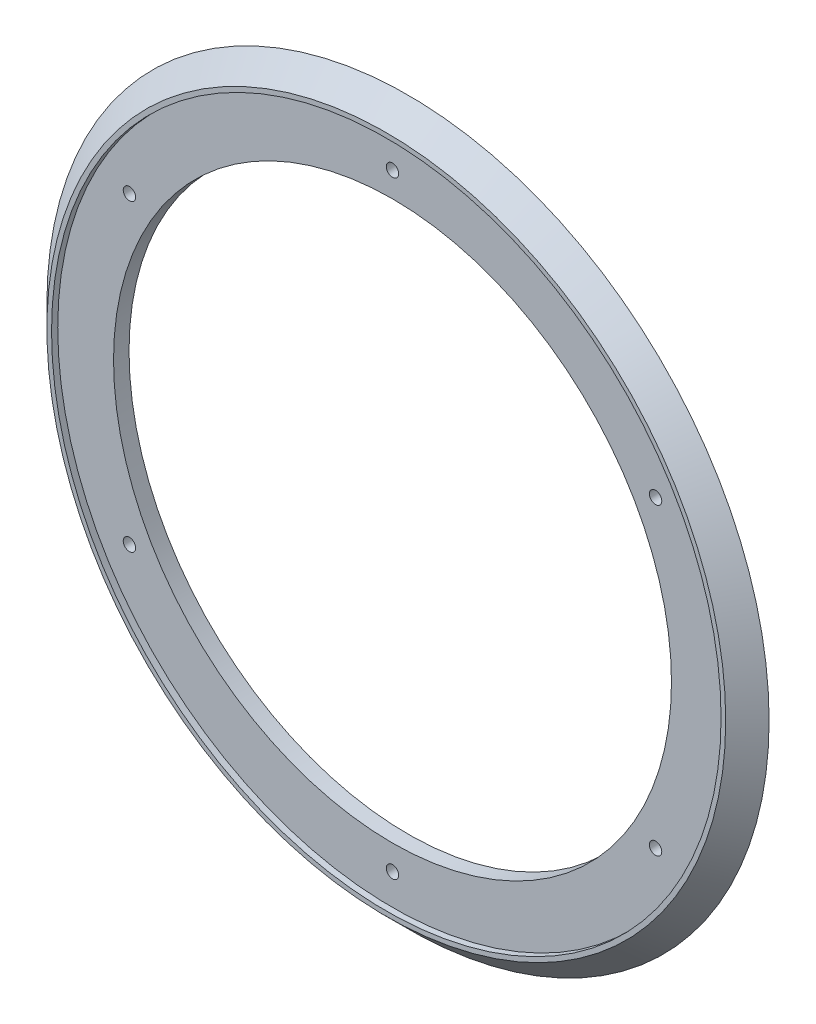
ISO-10303-21;
HEADER;
FILE_DESCRIPTION(('STEP AP214'),'2;1');
FILE_NAME('part.step','',(''),(''),'','','');
FILE_SCHEMA(('AUTOMOTIVE_DESIGN { 1 0 10303 214 1 1 1 1 }'));
ENDSEC;
DATA;
#1=APPLICATION_CONTEXT('core data for automotive mechanical design processes');
#2=APPLICATION_PROTOCOL_DEFINITION('international standard','automotive_design',2000,#1);
#3=PRODUCT_CONTEXT('',#1,'mechanical');
#4=PRODUCT('Part','Part','',(#3));
#5=PRODUCT_RELATED_PRODUCT_CATEGORY('part','',(#4));
#6=PRODUCT_DEFINITION_FORMATION('','',#4);
#7=PRODUCT_DEFINITION_CONTEXT('part definition',#1,'design');
#8=PRODUCT_DEFINITION('design','',#6,#7);
#9=PRODUCT_DEFINITION_SHAPE('','',#8);
#10=(LENGTH_UNIT() NAMED_UNIT(*) SI_UNIT(.MILLI.,.METRE.));
#11=(NAMED_UNIT(*) PLANE_ANGLE_UNIT() SI_UNIT($,.RADIAN.));
#12=(NAMED_UNIT(*) SI_UNIT($,.STERADIAN.) SOLID_ANGLE_UNIT());
#13=UNCERTAINTY_MEASURE_WITH_UNIT(LENGTH_MEASURE(1.E-05),#10,'distance_accuracy_value','');
#14=(GEOMETRIC_REPRESENTATION_CONTEXT(3) GLOBAL_UNCERTAINTY_ASSIGNED_CONTEXT((#13)) GLOBAL_UNIT_ASSIGNED_CONTEXT((#10,
#11,#12)) REPRESENTATION_CONTEXT('',''));
#15=CARTESIAN_POINT('',(0.,0.,0.));
#16=DIRECTION('',(0.,0.,1.));
#17=DIRECTION('',(1.,0.,0.));
#18=AXIS2_PLACEMENT_3D('',#15,#16,#17);
#19=CARTESIAN_POINT('',(0.,0.,7.));
#20=DIRECTION('',(0.,0.,1.));
#21=DIRECTION('',(1.,0.,0.));
#22=AXIS2_PLACEMENT_3D('',#19,#20,#21);
#23=PLANE('',#22);
#24=CARTESIAN_POINT('',(0.,0.,7.));
#25=DIRECTION('',(0.,0.,1.));
#26=DIRECTION('',(1.,0.,0.));
#27=AXIS2_PLACEMENT_3D('',#24,#25,#26);
#28=CIRCLE('',#27,108.);
#29=CARTESIAN_POINT('',(108.,0.,7.));
#30=VERTEX_POINT('',#29);
#31=EDGE_CURVE('E69',#30,#30,#28,.T.);
#32=ORIENTED_EDGE('',*,*,#31,.F.);
#33=EDGE_LOOP('',(#32));
#34=FACE_BOUND('',#33,.T.);
#35=CARTESIAN_POINT('',(0.,0.,7.));
#36=DIRECTION('',(0.,0.,1.));
#37=DIRECTION('',(1.,0.,0.));
#38=AXIS2_PLACEMENT_3D('',#35,#36,#37);
#39=CIRCLE('',#38,109.5);
#40=CARTESIAN_POINT('',(109.5,0.,7.));
#41=VERTEX_POINT('',#40);
#42=EDGE_CURVE('E40',#41,#41,#39,.T.);
#43=ORIENTED_EDGE('',*,*,#42,.T.);
#44=EDGE_LOOP('',(#43));
#45=FACE_BOUND('',#44,.T.);
#46=ADVANCED_FACE('F32',(#34,#45),#23,.T.);
#47=CARTESIAN_POINT('',(0.,0.,0.));
#48=DIRECTION('',(0.,0.,1.));
#49=DIRECTION('',(1.,0.,0.));
#50=AXIS2_PLACEMENT_3D('',#47,#48,#49);
#51=PLANE('',#50);
#52=CARTESIAN_POINT('',(84.8704895708729,48.9999999999963,0.));
#53=DIRECTION('',(0.,0.,-1.));
#54=DIRECTION('',(-1.,0.,0.));
#55=AXIS2_PLACEMENT_3D('',#52,#53,#54);
#56=CIRCLE('',#55,2.00000000000422);
#57=CARTESIAN_POINT('',(82.8704895708687,48.9999999999963,0.));
#58=VERTEX_POINT('',#57);
#59=EDGE_CURVE('E81',#58,#58,#56,.T.);
#60=ORIENTED_EDGE('',*,*,#59,.F.);
#61=EDGE_LOOP('',(#60));
#62=FACE_BOUND('',#61,.T.);
#63=CARTESIAN_POINT('',(84.8704895708687,-49.0000000000036,0.));
#64=DIRECTION('',(0.,0.,-1.));
#65=DIRECTION('',(-1.,0.,0.));
#66=AXIS2_PLACEMENT_3D('',#63,#64,#65);
#67=CIRCLE('',#66,2.00000000000795);
#68=CARTESIAN_POINT('',(82.8704895708608,-49.0000000000036,0.));
#69=VERTEX_POINT('',#68);
#70=EDGE_CURVE('E84',#69,#69,#67,.T.);
#71=ORIENTED_EDGE('',*,*,#70,.F.);
#72=EDGE_LOOP('',(#71));
#73=FACE_BOUND('',#72,.T.);
#74=CARTESIAN_POINT('',(-8.33197949527549E-12,-98.,0.));
#75=DIRECTION('',(0.,0.,-1.));
#76=DIRECTION('',(-1.,0.,0.));
#77=AXIS2_PLACEMENT_3D('',#74,#75,#76);
#78=CIRCLE('',#77,2.00000000000862);
#79=CARTESIAN_POINT('',(-2.00000000001695,-98.,0.));
#80=VERTEX_POINT('',#79);
#81=EDGE_CURVE('E87',#80,#80,#78,.T.);
#82=ORIENTED_EDGE('',*,*,#81,.F.);
#83=EDGE_LOOP('',(#82));
#84=FACE_BOUND('',#83,.T.);
#85=CARTESIAN_POINT('',(-84.8704895708812,-48.9999999999964,0.));
#86=DIRECTION('',(0.,0.,-1.));
#87=DIRECTION('',(-1.,0.,0.));
#88=AXIS2_PLACEMENT_3D('',#85,#86,#87);
#89=CIRCLE('',#88,2.00000000000536);
#90=CARTESIAN_POINT('',(-86.8704895708866,-48.9999999999964,0.));
#91=VERTEX_POINT('',#90);
#92=EDGE_CURVE('E90',#91,#91,#89,.T.);
#93=ORIENTED_EDGE('',*,*,#92,.F.);
#94=EDGE_LOOP('',(#93));
#95=FACE_BOUND('',#94,.T.);
#96=CARTESIAN_POINT('',(-84.8704895708771,49.0000000000036,0.));
#97=DIRECTION('',(0.,0.,-1.));
#98=DIRECTION('',(-1.,0.,0.));
#99=AXIS2_PLACEMENT_3D('',#96,#97,#98);
#100=CIRCLE('',#99,2.00000000000118);
#101=CARTESIAN_POINT('',(-86.8704895708782,49.0000000000036,0.));
#102=VERTEX_POINT('',#101);
#103=EDGE_CURVE('E93',#102,#102,#100,.T.);
#104=ORIENTED_EDGE('',*,*,#103,.F.);
#105=EDGE_LOOP('',(#104));
#106=FACE_BOUND('',#105,.T.);
#107=CARTESIAN_POINT('',(0.,98.,0.));
#108=DIRECTION('',(0.,0.,-1.));
#109=DIRECTION('',(-1.,0.,0.));
#110=AXIS2_PLACEMENT_3D('',#107,#108,#109);
#111=CIRCLE('',#110,2.);
#112=CARTESIAN_POINT('',(-2.,98.,0.));
#113=VERTEX_POINT('',#112);
#114=EDGE_CURVE('E80',#113,#113,#111,.T.);
#115=ORIENTED_EDGE('',*,*,#114,.F.);
#116=EDGE_LOOP('',(#115));
#117=FACE_BOUND('',#116,.T.);
#118=CARTESIAN_POINT('',(0.,0.,0.));
#119=DIRECTION('',(0.,0.,-1.));
#120=DIRECTION('',(-1.,0.,0.));
#121=AXIS2_PLACEMENT_3D('',#118,#119,#120);
#122=CIRCLE('',#121,90.);
#123=CARTESIAN_POINT('',(-90.,0.,0.));
#124=VERTEX_POINT('',#123);
#125=EDGE_CURVE('E53',#124,#124,#122,.T.);
#126=ORIENTED_EDGE('',*,*,#125,.F.);
#127=EDGE_LOOP('',(#126));
#128=FACE_BOUND('',#127,.T.);
#129=CARTESIAN_POINT('',(0.,0.,0.));
#130=DIRECTION('',(0.,0.,1.));
#131=DIRECTION('',(1.,0.,0.));
#132=AXIS2_PLACEMENT_3D('',#129,#130,#131);
#133=CIRCLE('',#132,116.5);
#134=CARTESIAN_POINT('',(116.5,0.,0.));
#135=VERTEX_POINT('',#134);
#136=EDGE_CURVE('E10',#135,#135,#133,.F.);
#137=ORIENTED_EDGE('',*,*,#136,.T.);
#138=EDGE_LOOP('',(#137));
#139=FACE_BOUND('',#138,.T.);
#140=ADVANCED_FACE('F101',(#62,#73,#84,#95,#106,#117,#128,#139),#51,.F.);
#141=CARTESIAN_POINT('',(0.,0.,7.));
#142=DIRECTION('',(0.,0.,-1.));
#143=DIRECTION('',(-1.,0.,0.));
#144=AXIS2_PLACEMENT_3D('',#141,#142,#143);
#145=CONICAL_SURFACE('',#144,109.5,0.785398163397453);
#146=ORIENTED_EDGE('',*,*,#136,.F.);
#147=EDGE_LOOP('',(#146));
#148=FACE_BOUND('',#147,.T.);
#149=ORIENTED_EDGE('',*,*,#42,.F.);
#150=EDGE_LOOP('',(#149));
#151=FACE_BOUND('',#150,.T.);
#152=ADVANCED_FACE('F34',(#148,#151),#145,.T.);
#153=CARTESIAN_POINT('',(0.,0.,5.));
#154=DIRECTION('',(0.,0.,1.));
#155=DIRECTION('',(1.,0.,0.));
#156=AXIS2_PLACEMENT_3D('',#153,#154,#155);
#157=CYLINDRICAL_SURFACE('',#156,108.);
#158=CARTESIAN_POINT('',(0.,0.,5.));
#159=DIRECTION('',(0.,0.,1.));
#160=DIRECTION('',(1.,0.,0.));
#161=AXIS2_PLACEMENT_3D('',#158,#159,#160);
#162=CIRCLE('',#161,108.);
#163=CARTESIAN_POINT('',(108.,0.,5.));
#164=VERTEX_POINT('',#163);
#165=EDGE_CURVE('E45',#164,#164,#162,.T.);
#166=ORIENTED_EDGE('',*,*,#165,.F.);
#167=EDGE_LOOP('',(#166));
#168=FACE_BOUND('',#167,.T.);
#169=ORIENTED_EDGE('',*,*,#31,.T.);
#170=EDGE_LOOP('',(#169));
#171=FACE_BOUND('',#170,.T.);
#172=ADVANCED_FACE('F119',(#168,#171),#157,.F.);
#173=CARTESIAN_POINT('',(0.,0.,5.));
#174=DIRECTION('',(0.,0.,1.));
#175=DIRECTION('',(1.,0.,0.));
#176=AXIS2_PLACEMENT_3D('',#173,#174,#175);
#177=PLANE('',#176);
#178=CARTESIAN_POINT('',(84.8704895708729,48.9999999999963,5.));
#179=DIRECTION('',(0.,0.,1.));
#180=DIRECTION('',(1.,0.,0.));
#181=AXIS2_PLACEMENT_3D('',#178,#179,#180);
#182=CIRCLE('',#181,2.00000000000422);
#183=CARTESIAN_POINT('',(86.8704895708772,48.9999999999963,5.));
#184=VERTEX_POINT('',#183);
#185=EDGE_CURVE('E36',#184,#184,#182,.T.);
#186=ORIENTED_EDGE('',*,*,#185,.F.);
#187=EDGE_LOOP('',(#186));
#188=FACE_BOUND('',#187,.T.);
#189=CARTESIAN_POINT('',(84.8704895708687,-49.0000000000036,5.));
#190=DIRECTION('',(0.,0.,1.));
#191=DIRECTION('',(1.,0.,0.));
#192=AXIS2_PLACEMENT_3D('',#189,#190,#191);
#193=CIRCLE('',#192,2.00000000000795);
#194=CARTESIAN_POINT('',(86.8704895708767,-49.0000000000036,5.));
#195=VERTEX_POINT('',#194);
#196=EDGE_CURVE('E64',#195,#195,#193,.T.);
#197=ORIENTED_EDGE('',*,*,#196,.F.);
#198=EDGE_LOOP('',(#197));
#199=FACE_BOUND('',#198,.T.);
#200=CARTESIAN_POINT('',(-8.33197949527549E-12,-98.,5.));
#201=DIRECTION('',(0.,0.,1.));
#202=DIRECTION('',(1.,0.,0.));
#203=AXIS2_PLACEMENT_3D('',#200,#201,#202);
#204=CIRCLE('',#203,2.00000000000862);
#205=CARTESIAN_POINT('',(2.00000000000029,-98.,5.));
#206=VERTEX_POINT('',#205);
#207=EDGE_CURVE('E62',#206,#206,#204,.T.);
#208=ORIENTED_EDGE('',*,*,#207,.F.);
#209=EDGE_LOOP('',(#208));
#210=FACE_BOUND('',#209,.T.);
#211=CARTESIAN_POINT('',(-84.8704895708812,-48.9999999999964,5.));
#212=DIRECTION('',(0.,0.,1.));
#213=DIRECTION('',(1.,0.,0.));
#214=AXIS2_PLACEMENT_3D('',#211,#212,#213);
#215=CIRCLE('',#214,2.00000000000536);
#216=CARTESIAN_POINT('',(-82.8704895708759,-48.9999999999964,5.));
#217=VERTEX_POINT('',#216);
#218=EDGE_CURVE('E59',#217,#217,#215,.T.);
#219=ORIENTED_EDGE('',*,*,#218,.F.);
#220=EDGE_LOOP('',(#219));
#221=FACE_BOUND('',#220,.T.);
#222=CARTESIAN_POINT('',(-84.8704895708771,49.0000000000036,5.));
#223=DIRECTION('',(0.,0.,1.));
#224=DIRECTION('',(1.,0.,0.));
#225=AXIS2_PLACEMENT_3D('',#222,#223,#224);
#226=CIRCLE('',#225,2.00000000000118);
#227=CARTESIAN_POINT('',(-82.8704895708759,49.0000000000036,5.));
#228=VERTEX_POINT('',#227);
#229=EDGE_CURVE('E56',#228,#228,#226,.T.);
#230=ORIENTED_EDGE('',*,*,#229,.F.);
#231=EDGE_LOOP('',(#230));
#232=FACE_BOUND('',#231,.T.);
#233=CARTESIAN_POINT('',(0.,98.,5.));
#234=DIRECTION('',(0.,0.,1.));
#235=DIRECTION('',(1.,0.,0.));
#236=AXIS2_PLACEMENT_3D('',#233,#234,#235);
#237=CIRCLE('',#236,2.);
#238=CARTESIAN_POINT('',(2.,98.,5.));
#239=VERTEX_POINT('',#238);
#240=EDGE_CURVE('E52',#239,#239,#237,.T.);
#241=ORIENTED_EDGE('',*,*,#240,.F.);
#242=EDGE_LOOP('',(#241));
#243=FACE_BOUND('',#242,.T.);
#244=CARTESIAN_POINT('',(0.,0.,5.));
#245=DIRECTION('',(0.,0.,1.));
#246=DIRECTION('',(1.,0.,0.));
#247=AXIS2_PLACEMENT_3D('',#244,#245,#246);
#248=CIRCLE('',#247,90.);
#249=CARTESIAN_POINT('',(90.,0.,5.));
#250=VERTEX_POINT('',#249);
#251=EDGE_CURVE('E49',#250,#250,#248,.T.);
#252=ORIENTED_EDGE('',*,*,#251,.F.);
#253=EDGE_LOOP('',(#252));
#254=FACE_BOUND('',#253,.T.);
#255=ORIENTED_EDGE('',*,*,#165,.T.);
#256=EDGE_LOOP('',(#255));
#257=FACE_BOUND('',#256,.T.);
#258=ADVANCED_FACE('F109',(#188,#199,#210,#221,#232,#243,#254,#257),#177,.T.);
#259=CARTESIAN_POINT('',(0.,0.,7.));
#260=DIRECTION('',(0.,0.,-1.));
#261=DIRECTION('',(-1.,0.,0.));
#262=AXIS2_PLACEMENT_3D('',#259,#260,#261);
#263=CYLINDRICAL_SURFACE('',#262,90.);
#264=ORIENTED_EDGE('',*,*,#251,.T.);
#265=EDGE_LOOP('',(#264));
#266=FACE_BOUND('',#265,.T.);
#267=ORIENTED_EDGE('',*,*,#125,.T.);
#268=EDGE_LOOP('',(#267));
#269=FACE_BOUND('',#268,.T.);
#270=ADVANCED_FACE('F107',(#266,#269),#263,.F.);
#271=CARTESIAN_POINT('',(0.,98.,7.));
#272=DIRECTION('',(0.,0.,-1.));
#273=DIRECTION('',(-1.,0.,0.));
#274=AXIS2_PLACEMENT_3D('',#271,#272,#273);
#275=CYLINDRICAL_SURFACE('',#274,2.);
#276=ORIENTED_EDGE('',*,*,#240,.T.);
#277=EDGE_LOOP('',(#276));
#278=FACE_BOUND('',#277,.T.);
#279=ORIENTED_EDGE('',*,*,#114,.T.);
#280=EDGE_LOOP('',(#279));
#281=FACE_BOUND('',#280,.T.);
#282=ADVANCED_FACE('F99',(#278,#281),#275,.F.);
#283=CARTESIAN_POINT('',(-84.8704895708771,49.0000000000036,7.));
#284=DIRECTION('',(0.,0.,-1.));
#285=DIRECTION('',(-1.,0.,0.));
#286=AXIS2_PLACEMENT_3D('',#283,#284,#285);
#287=CYLINDRICAL_SURFACE('',#286,2.00000000000118);
#288=ORIENTED_EDGE('',*,*,#229,.T.);
#289=EDGE_LOOP('',(#288));
#290=FACE_BOUND('',#289,.T.);
#291=ORIENTED_EDGE('',*,*,#103,.T.);
#292=EDGE_LOOP('',(#291));
#293=FACE_BOUND('',#292,.T.);
#294=ADVANCED_FACE('F116',(#290,#293),#287,.F.);
#295=CARTESIAN_POINT('',(-84.8704895708812,-48.9999999999964,7.));
#296=DIRECTION('',(0.,0.,-1.));
#297=DIRECTION('',(-1.,0.,0.));
#298=AXIS2_PLACEMENT_3D('',#295,#296,#297);
#299=CYLINDRICAL_SURFACE('',#298,2.00000000000536);
#300=ORIENTED_EDGE('',*,*,#218,.T.);
#301=EDGE_LOOP('',(#300));
#302=FACE_BOUND('',#301,.T.);
#303=ORIENTED_EDGE('',*,*,#92,.T.);
#304=EDGE_LOOP('',(#303));
#305=FACE_BOUND('',#304,.T.);
#306=ADVANCED_FACE('F174',(#302,#305),#299,.F.);
#307=CARTESIAN_POINT('',(-8.33197949527549E-12,-98.,7.));
#308=DIRECTION('',(0.,0.,-1.));
#309=DIRECTION('',(-1.,0.,0.));
#310=AXIS2_PLACEMENT_3D('',#307,#308,#309);
#311=CYLINDRICAL_SURFACE('',#310,2.00000000000862);
#312=ORIENTED_EDGE('',*,*,#207,.T.);
#313=EDGE_LOOP('',(#312));
#314=FACE_BOUND('',#313,.T.);
#315=ORIENTED_EDGE('',*,*,#81,.T.);
#316=EDGE_LOOP('',(#315));
#317=FACE_BOUND('',#316,.T.);
#318=ADVANCED_FACE('F184',(#314,#317),#311,.F.);
#319=CARTESIAN_POINT('',(84.8704895708687,-49.0000000000036,7.));
#320=DIRECTION('',(0.,0.,-1.));
#321=DIRECTION('',(-1.,0.,0.));
#322=AXIS2_PLACEMENT_3D('',#319,#320,#321);
#323=CYLINDRICAL_SURFACE('',#322,2.00000000000795);
#324=ORIENTED_EDGE('',*,*,#196,.T.);
#325=EDGE_LOOP('',(#324));
#326=FACE_BOUND('',#325,.T.);
#327=ORIENTED_EDGE('',*,*,#70,.T.);
#328=EDGE_LOOP('',(#327));
#329=FACE_BOUND('',#328,.T.);
#330=ADVANCED_FACE('F194',(#326,#329),#323,.F.);
#331=CARTESIAN_POINT('',(84.8704895708729,48.9999999999963,7.));
#332=DIRECTION('',(0.,0.,-1.));
#333=DIRECTION('',(-1.,0.,0.));
#334=AXIS2_PLACEMENT_3D('',#331,#332,#333);
#335=CYLINDRICAL_SURFACE('',#334,2.00000000000422);
#336=ORIENTED_EDGE('',*,*,#185,.T.);
#337=EDGE_LOOP('',(#336));
#338=FACE_BOUND('',#337,.T.);
#339=ORIENTED_EDGE('',*,*,#59,.T.);
#340=EDGE_LOOP('',(#339));
#341=FACE_BOUND('',#340,.T.);
#342=ADVANCED_FACE('F204',(#338,#341),#335,.F.);
#343=CLOSED_SHELL('',(#46,#140,#152,#172,#258,#270,#282,#294,#306,#318,#330,#342));
#344=MANIFOLD_SOLID_BREP('B2',#343);
#345=ADVANCED_BREP_SHAPE_REPRESENTATION('',(#18,#344),#14);
#346=SHAPE_DEFINITION_REPRESENTATION(#9,#345);
ENDSEC;
END-ISO-10303-21;
